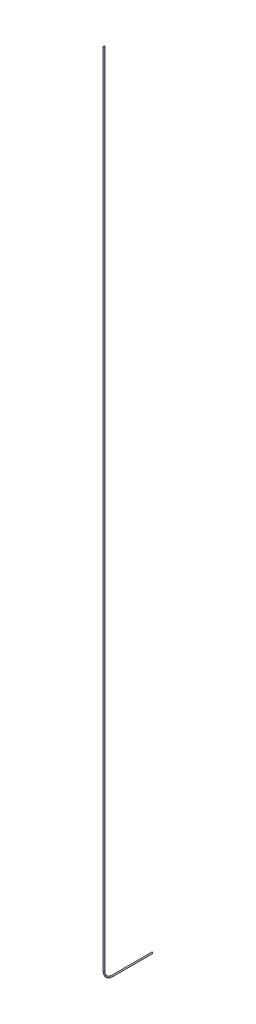
ISO-10303-21;
HEADER;
FILE_DESCRIPTION(('STEP AP214'),'2;1');
FILE_NAME('part.step','',(''),(''),'','','');
FILE_SCHEMA(('AUTOMOTIVE_DESIGN { 1 0 10303 214 1 1 1 1 }'));
ENDSEC;
DATA;
#1=APPLICATION_CONTEXT('core data for automotive mechanical design processes');
#2=APPLICATION_PROTOCOL_DEFINITION('international standard','automotive_design',2000,#1);
#3=PRODUCT_CONTEXT('',#1,'mechanical');
#4=PRODUCT('Part','Part','',(#3));
#5=PRODUCT_RELATED_PRODUCT_CATEGORY('part','',(#4));
#6=PRODUCT_DEFINITION_FORMATION('','',#4);
#7=PRODUCT_DEFINITION_CONTEXT('part definition',#1,'design');
#8=PRODUCT_DEFINITION('design','',#6,#7);
#9=PRODUCT_DEFINITION_SHAPE('','',#8);
#10=(LENGTH_UNIT() NAMED_UNIT(*) SI_UNIT(.MILLI.,.METRE.));
#11=(NAMED_UNIT(*) PLANE_ANGLE_UNIT() SI_UNIT($,.RADIAN.));
#12=(NAMED_UNIT(*) SI_UNIT($,.STERADIAN.) SOLID_ANGLE_UNIT());
#13=UNCERTAINTY_MEASURE_WITH_UNIT(LENGTH_MEASURE(1.E-05),#10,'distance_accuracy_value','');
#14=(GEOMETRIC_REPRESENTATION_CONTEXT(3) GLOBAL_UNCERTAINTY_ASSIGNED_CONTEXT((#13)) GLOBAL_UNIT_ASSIGNED_CONTEXT((#10,
#11,#12)) REPRESENTATION_CONTEXT('',''));
#15=CARTESIAN_POINT('',(0.,0.,0.));
#16=DIRECTION('',(0.,0.,1.));
#17=DIRECTION('',(1.,0.,0.));
#18=AXIS2_PLACEMENT_3D('',#15,#16,#17);
#19=CARTESIAN_POINT('',(0.,0.,20.));
#20=DIRECTION('',(0.,0.,-1.));
#21=DIRECTION('',(-1.,0.,0.));
#22=AXIS2_PLACEMENT_3D('',#19,#20,#21);
#23=CYLINDRICAL_SURFACE('',#22,0.4);
#24=CARTESIAN_POINT('',(0.,0.,0.));
#25=DIRECTION('',(0.,0.,1.));
#26=DIRECTION('',(1.,0.,0.));
#27=AXIS2_PLACEMENT_3D('',#24,#25,#26);
#28=CIRCLE('',#27,0.4);
#29=CARTESIAN_POINT('',(0.4,0.,0.));
#30=VERTEX_POINT('',#29);
#31=EDGE_CURVE('E10',#30,#30,#28,.T.);
#32=ORIENTED_EDGE('',*,*,#31,.T.);
#33=EDGE_LOOP('',(#32));
#34=FACE_BOUND('',#33,.T.);
#35=CARTESIAN_POINT('',(0.,0.,25.));
#36=DIRECTION('',(0.,0.,1.));
#37=DIRECTION('',(1.,0.,0.));
#38=AXIS2_PLACEMENT_3D('',#35,#36,#37);
#39=CIRCLE('',#38,0.4);
#40=CARTESIAN_POINT('',(0.,-0.399999999999836,25.));
#41=VERTEX_POINT('',#40);
#42=EDGE_CURVE('E56',#41,#41,#39,.T.);
#43=ORIENTED_EDGE('',*,*,#42,.F.);
#44=EDGE_LOOP('',(#43));
#45=FACE_BOUND('',#44,.T.);
#46=ADVANCED_FACE('F39',(#34,#45),#23,.T.);
#47=CARTESIAN_POINT('',(0.,0.,0.));
#48=DIRECTION('',(0.,0.,1.));
#49=DIRECTION('',(1.,0.,0.));
#50=AXIS2_PLACEMENT_3D('',#47,#48,#49);
#51=PLANE('',#50);
#52=ORIENTED_EDGE('',*,*,#31,.F.);
#53=EDGE_LOOP('',(#52));
#54=FACE_BOUND('',#53,.T.);
#55=ADVANCED_FACE('F66',(#54),#51,.F.);
#56=CARTESIAN_POINT('',(0.,505.,30.));
#57=DIRECTION('',(0.,1.,0.));
#58=DIRECTION('',(1.,0.,0.));
#59=AXIS2_PLACEMENT_3D('',#56,#57,#58);
#60=PLANE('',#59);
#61=CARTESIAN_POINT('',(0.,505.,30.));
#62=DIRECTION('',(0.,1.,0.));
#63=DIRECTION('',(1.,0.,0.));
#64=AXIS2_PLACEMENT_3D('',#61,#62,#63);
#65=CIRCLE('',#64,0.4);
#66=CARTESIAN_POINT('',(0.4,505.,30.));
#67=VERTEX_POINT('',#66);
#68=EDGE_CURVE('E46',#67,#67,#65,.T.);
#69=ORIENTED_EDGE('',*,*,#68,.T.);
#70=EDGE_LOOP('',(#69));
#71=FACE_BOUND('',#70,.T.);
#72=ADVANCED_FACE('F70',(#71),#60,.T.);
#73=CARTESIAN_POINT('',(0.,5.,25.));
#74=DIRECTION('',(-1.,0.,0.));
#75=DIRECTION('',(0.,0.,1.));
#76=AXIS2_PLACEMENT_3D('',#73,#74,#75);
#77=TOROIDAL_SURFACE('',#76,4.99999999999984,0.4);
#78=CARTESIAN_POINT('',(0.,5.,30.));
#79=DIRECTION('',(0.,1.,0.));
#80=DIRECTION('',(1.,0.,0.));
#81=AXIS2_PLACEMENT_3D('',#78,#79,#80);
#82=CIRCLE('',#81,0.4);
#83=CARTESIAN_POINT('',(0.,5.,30.3999999999998));
#84=VERTEX_POINT('',#83);
#85=EDGE_CURVE('E51',#84,#84,#82,.T.);
#86=CARTESIAN_POINT('',(0.,5.,25.));
#87=DIRECTION('',(-1.,0.,0.));
#88=DIRECTION('',(0.,0.,1.));
#89=AXIS2_PLACEMENT_3D('',#86,#87,#88);
#90=CIRCLE('',#89,5.39999999999984);
#91=EDGE_CURVE('',#41,#84,#90,.T.);
#92=ORIENTED_EDGE('',*,*,#42,.T.);
#93=ORIENTED_EDGE('',*,*,#85,.F.);
#94=ORIENTED_EDGE('',*,*,#91,.T.);
#95=ORIENTED_EDGE('',*,*,#91,.F.);
#96=EDGE_LOOP('',(#92,#94,#93,#95));
#97=FACE_BOUND('',#96,.T.);
#98=ADVANCED_FACE('F63',(#97),#77,.T.);
#99=CARTESIAN_POINT('',(0.,5.,30.));
#100=DIRECTION('',(0.,1.,0.));
#101=DIRECTION('',(0.,0.,1.));
#102=AXIS2_PLACEMENT_3D('',#99,#100,#101);
#103=CYLINDRICAL_SURFACE('',#102,0.4);
#104=ORIENTED_EDGE('',*,*,#68,.F.);
#105=EDGE_LOOP('',(#104));
#106=FACE_BOUND('',#105,.T.);
#107=ORIENTED_EDGE('',*,*,#85,.T.);
#108=EDGE_LOOP('',(#107));
#109=FACE_BOUND('',#108,.T.);
#110=ADVANCED_FACE('F72',(#106,#109),#103,.T.);
#111=CLOSED_SHELL('',(#46,#55,#72,#98,#110));
#112=MANIFOLD_SOLID_BREP('B2',#111);
#113=ADVANCED_BREP_SHAPE_REPRESENTATION('',(#18,#112),#14);
#114=SHAPE_DEFINITION_REPRESENTATION(#9,#113);
ENDSEC;
END-ISO-10303-21;
